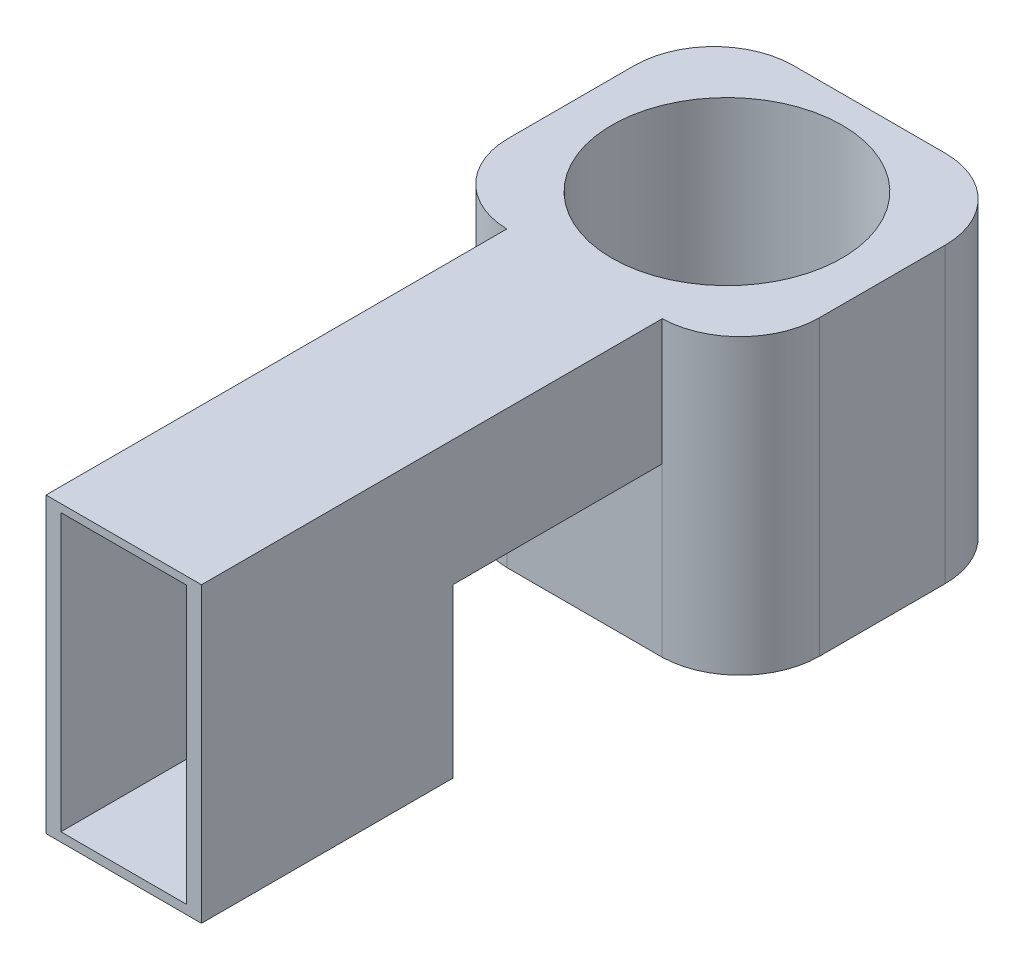
ISO-10303-21;
HEADER;
FILE_DESCRIPTION(('STEP AP214'),'2;1');
FILE_NAME('part.step','',(''),(''),'','','');
FILE_SCHEMA(('AUTOMOTIVE_DESIGN { 1 0 10303 214 1 1 1 1 }'));
ENDSEC;
DATA;
#1=APPLICATION_CONTEXT('core data for automotive mechanical design processes');
#2=APPLICATION_PROTOCOL_DEFINITION('international standard','automotive_design',2000,#1);
#3=PRODUCT_CONTEXT('',#1,'mechanical');
#4=PRODUCT('Part','Part','',(#3));
#5=PRODUCT_RELATED_PRODUCT_CATEGORY('part','',(#4));
#6=PRODUCT_DEFINITION_FORMATION('','',#4);
#7=PRODUCT_DEFINITION_CONTEXT('part definition',#1,'design');
#8=PRODUCT_DEFINITION('design','',#6,#7);
#9=PRODUCT_DEFINITION_SHAPE('','',#8);
#10=(LENGTH_UNIT() NAMED_UNIT(*) SI_UNIT(.MILLI.,.METRE.));
#11=(NAMED_UNIT(*) PLANE_ANGLE_UNIT() SI_UNIT($,.RADIAN.));
#12=(NAMED_UNIT(*) SI_UNIT($,.STERADIAN.) SOLID_ANGLE_UNIT());
#13=UNCERTAINTY_MEASURE_WITH_UNIT(LENGTH_MEASURE(1.E-05),#10,'distance_accuracy_value','');
#14=(GEOMETRIC_REPRESENTATION_CONTEXT(3) GLOBAL_UNCERTAINTY_ASSIGNED_CONTEXT((#13)) GLOBAL_UNIT_ASSIGNED_CONTEXT((#10,
#11,#12)) REPRESENTATION_CONTEXT('',''));
#15=CARTESIAN_POINT('',(0.,0.,0.));
#16=DIRECTION('',(0.,0.,1.));
#17=DIRECTION('',(1.,0.,0.));
#18=AXIS2_PLACEMENT_3D('',#15,#16,#17);
#19=CARTESIAN_POINT('',(0.,-70.,0.));
#20=DIRECTION('',(0.,1.,0.));
#21=DIRECTION('',(0.,0.,1.));
#22=AXIS2_PLACEMENT_3D('',#19,#20,#21);
#23=PLANE('',#22);
#24=CARTESIAN_POINT('',(-37.1118444749738,-70.,34.));
#25=DIRECTION('',(0.,1.,0.));
#26=DIRECTION('',(0.,0.,1.));
#27=AXIS2_PLACEMENT_3D('',#24,#25,#26);
#28=CIRCLE('',#27,27.5);
#29=CARTESIAN_POINT('',(-37.1118444749738,-70.,61.5));
#30=VERTEX_POINT('',#29);
#31=EDGE_CURVE('E254',#30,#30,#28,.T.);
#32=ORIENTED_EDGE('',*,*,#31,.T.);
#33=EDGE_LOOP('',(#32));
#34=FACE_BOUND('',#33,.T.);
#35=CARTESIAN_POINT('',(-19.,-70.,49.0051903157509));
#36=DIRECTION('',(0.,1.,0.));
#37=DIRECTION('',(0.,0.,1.));
#38=AXIS2_PLACEMENT_3D('',#35,#36,#37);
#39=CIRCLE('',#38,19.);
#40=CARTESIAN_POINT('',(0.,-70.,49.0051903157509));
#41=VERTEX_POINT('',#40);
#42=CARTESIAN_POINT('',(-18.5559222374874,-70.,68.));
#43=VERTEX_POINT('',#42);
#44=EDGE_CURVE('E325',#41,#43,#39,.F.);
#45=ORIENTED_EDGE('',*,*,#44,.T.);
#46=DIRECTION('',(-1.,0.,0.));
#47=VECTOR('',#46,1.);
#48=CARTESIAN_POINT('',(2.33223328753923,-70.,68.));
#49=LINE('',#48,#47);
#50=CARTESIAN_POINT('',(-55.6677667124608,-70.,68.));
#51=VERTEX_POINT('',#50);
#52=EDGE_CURVE('E239',#43,#51,#49,.T.);
#53=ORIENTED_EDGE('',*,*,#52,.T.);
#54=CARTESIAN_POINT('',(-55.2236889499477,-70.,49.005190315751));
#55=DIRECTION('',(0.,1.,0.));
#56=DIRECTION('',(0.,0.,1.));
#57=AXIS2_PLACEMENT_3D('',#54,#55,#56);
#58=CIRCLE('',#57,19.);
#59=CARTESIAN_POINT('',(-74.2236889499477,-70.,49.0051903157509));
#60=VERTEX_POINT('',#59);
#61=EDGE_CURVE('E321',#51,#60,#58,.F.);
#62=ORIENTED_EDGE('',*,*,#61,.T.);
#63=DIRECTION('',(0.,0.,1.));
#64=VECTOR('',#63,1.);
#65=CARTESIAN_POINT('',(-74.2236889499477,-70.,0.));
#66=LINE('',#65,#64);
#67=CARTESIAN_POINT('',(-74.2236889499477,-70.,19.));
#68=VERTEX_POINT('',#67);
#69=EDGE_CURVE('E263',#68,#60,#66,.T.);
#70=ORIENTED_EDGE('',*,*,#69,.F.);
#71=CARTESIAN_POINT('',(-55.2236889499477,-70.,19.));
#72=DIRECTION('',(0.,1.,0.));
#73=DIRECTION('',(0.,0.,1.));
#74=AXIS2_PLACEMENT_3D('',#71,#72,#73);
#75=CIRCLE('',#74,19.);
#76=CARTESIAN_POINT('',(-55.2236889499477,-70.,0.));
#77=VERTEX_POINT('',#76);
#78=EDGE_CURVE('E319',#68,#77,#75,.F.);
#79=ORIENTED_EDGE('',*,*,#78,.T.);
#80=DIRECTION('',(-1.,0.,0.));
#81=VECTOR('',#80,1.);
#82=CARTESIAN_POINT('',(0.,-70.,0.));
#83=LINE('',#82,#81);
#84=CARTESIAN_POINT('',(-19.,-70.,0.));
#85=VERTEX_POINT('',#84);
#86=EDGE_CURVE('E260',#85,#77,#83,.T.);
#87=ORIENTED_EDGE('',*,*,#86,.F.);
#88=CARTESIAN_POINT('',(-19.,-70.,19.));
#89=DIRECTION('',(0.,1.,0.));
#90=DIRECTION('',(0.,0.,1.));
#91=AXIS2_PLACEMENT_3D('',#88,#89,#90);
#92=CIRCLE('',#91,19.);
#93=CARTESIAN_POINT('',(0.,-70.,19.));
#94=VERTEX_POINT('',#93);
#95=EDGE_CURVE('E323',#85,#94,#92,.F.);
#96=ORIENTED_EDGE('',*,*,#95,.T.);
#97=DIRECTION('',(0.,0.,1.));
#98=VECTOR('',#97,1.);
#99=CARTESIAN_POINT('',(0.,-70.,0.));
#100=LINE('',#99,#98);
#101=EDGE_CURVE('E275',#94,#41,#100,.T.);
#102=ORIENTED_EDGE('',*,*,#101,.T.);
#103=EDGE_LOOP('',(#45,#53,#62,#70,#79,#87,#96,#102));
#104=FACE_BOUND('',#103,.T.);
#105=ADVANCED_FACE('F34',(#34,#104),#23,.F.);
#106=CARTESIAN_POINT('',(0.,-70.,0.));
#107=DIRECTION('',(0.,0.,-1.));
#108=DIRECTION('',(-1.,0.,0.));
#109=AXIS2_PLACEMENT_3D('',#106,#107,#108);
#110=PLANE('',#109);
#111=DIRECTION('',(-1.,0.,0.));
#112=VECTOR('',#111,1.);
#113=CARTESIAN_POINT('',(0.,0.,0.));
#114=LINE('',#113,#112);
#115=CARTESIAN_POINT('',(-19.,0.,0.));
#116=VERTEX_POINT('',#115);
#117=CARTESIAN_POINT('',(-55.2236889499477,0.,0.));
#118=VERTEX_POINT('',#117);
#119=EDGE_CURVE('E257',#116,#118,#114,.T.);
#120=ORIENTED_EDGE('',*,*,#119,.F.);
#121=DIRECTION('',(0.,1.,0.));
#122=VECTOR('',#121,1.);
#123=CARTESIAN_POINT('',(-19.,-70.,0.));
#124=LINE('',#123,#122);
#125=EDGE_CURVE('E331',#116,#85,#124,.F.);
#126=ORIENTED_EDGE('',*,*,#125,.T.);
#127=ORIENTED_EDGE('',*,*,#86,.T.);
#128=DIRECTION('',(0.,1.,0.));
#129=VECTOR('',#128,1.);
#130=CARTESIAN_POINT('',(-55.2236889499477,-70.,0.));
#131=LINE('',#130,#129);
#132=EDGE_CURVE('E328',#77,#118,#131,.T.);
#133=ORIENTED_EDGE('',*,*,#132,.T.);
#134=EDGE_LOOP('',(#120,#126,#127,#133));
#135=FACE_BOUND('',#134,.T.);
#136=ADVANCED_FACE('F346',(#135),#110,.T.);
#137=CARTESIAN_POINT('',(0.,-70.,0.));
#138=DIRECTION('',(-1.,0.,0.));
#139=DIRECTION('',(0.,0.,1.));
#140=AXIS2_PLACEMENT_3D('',#137,#138,#139);
#141=PLANE('',#140);
#142=DIRECTION('',(0.,0.,1.));
#143=VECTOR('',#142,1.);
#144=CARTESIAN_POINT('',(0.,0.,0.));
#145=LINE('',#144,#143);
#146=CARTESIAN_POINT('',(0.,0.,19.));
#147=VERTEX_POINT('',#146);
#148=CARTESIAN_POINT('',(0.,0.,49.0051903157509));
#149=VERTEX_POINT('',#148);
#150=EDGE_CURVE('E264',#147,#149,#145,.T.);
#151=ORIENTED_EDGE('',*,*,#150,.T.);
#152=DIRECTION('',(0.,-1.,0.));
#153=VECTOR('',#152,1.);
#154=CARTESIAN_POINT('',(0.,-70.,49.0051903157509));
#155=LINE('',#154,#153);
#156=EDGE_CURVE('E317',#149,#41,#155,.T.);
#157=ORIENTED_EDGE('',*,*,#156,.T.);
#158=ORIENTED_EDGE('',*,*,#101,.F.);
#159=DIRECTION('',(0.,1.,0.));
#160=VECTOR('',#159,1.);
#161=CARTESIAN_POINT('',(0.,0.,19.));
#162=LINE('',#161,#160);
#163=EDGE_CURVE('E314',#94,#147,#162,.T.);
#164=ORIENTED_EDGE('',*,*,#163,.T.);
#165=EDGE_LOOP('',(#151,#157,#158,#164));
#166=FACE_BOUND('',#165,.T.);
#167=ADVANCED_FACE('F357',(#166),#141,.F.);
#168=CARTESIAN_POINT('',(-18.5559222374869,-70.,0.));
#169=DIRECTION('',(1.,0.,0.));
#170=DIRECTION('',(0.,0.,-1.));
#171=AXIS2_PLACEMENT_3D('',#168,#169,#170);
#172=PLANE('',#171);
#173=DIRECTION('',(0.,0.,1.));
#174=VECTOR('',#173,1.);
#175=CARTESIAN_POINT('',(-18.5559222374869,-30.,0.));
#176=LINE('',#175,#174);
#177=CARTESIAN_POINT('',(-18.5559222374874,-30.,68.));
#178=VERTEX_POINT('',#177);
#179=CARTESIAN_POINT('',(-18.5559222374869,-30.,118.));
#180=VERTEX_POINT('',#179);
#181=EDGE_CURVE('E243',#178,#180,#176,.T.);
#182=ORIENTED_EDGE('',*,*,#181,.F.);
#183=DIRECTION('',(0.,1.,0.));
#184=VECTOR('',#183,1.);
#185=CARTESIAN_POINT('',(-18.5559222374869,-70.,68.));
#186=LINE('',#185,#184);
#187=CARTESIAN_POINT('',(-18.5559222374869,0.,68.));
#188=VERTEX_POINT('',#187);
#189=EDGE_CURVE('E298',#178,#188,#186,.T.);
#190=ORIENTED_EDGE('',*,*,#189,.T.);
#191=DIRECTION('',(0.,0.,-1.));
#192=VECTOR('',#191,1.);
#193=CARTESIAN_POINT('',(-18.5559222374869,0.,0.));
#194=LINE('',#193,#192);
#195=CARTESIAN_POINT('',(-18.5559222374869,0.,178.));
#196=VERTEX_POINT('',#195);
#197=EDGE_CURVE('E290',#196,#188,#194,.T.);
#198=ORIENTED_EDGE('',*,*,#197,.F.);
#199=DIRECTION('',(0.,1.,0.));
#200=VECTOR('',#199,1.);
#201=CARTESIAN_POINT('',(-18.5559222374869,-70.,178.));
#202=LINE('',#201,#200);
#203=CARTESIAN_POINT('',(-18.5559222374869,-70.,178.));
#204=VERTEX_POINT('',#203);
#205=EDGE_CURVE('E299',#204,#196,#202,.T.);
#206=ORIENTED_EDGE('',*,*,#205,.F.);
#207=DIRECTION('',(0.,0.,-1.));
#208=VECTOR('',#207,1.);
#209=CARTESIAN_POINT('',(-18.5559222374869,-70.,0.));
#210=LINE('',#209,#208);
#211=CARTESIAN_POINT('',(-18.5559222374869,-70.,118.));
#212=VERTEX_POINT('',#211);
#213=EDGE_CURVE('E272',#204,#212,#210,.T.);
#214=ORIENTED_EDGE('',*,*,#213,.T.);
#215=DIRECTION('',(0.,-1.,0.));
#216=VECTOR('',#215,1.);
#217=CARTESIAN_POINT('',(-18.5559222374869,-70.,118.));
#218=LINE('',#217,#216);
#219=EDGE_CURVE('E251',#180,#212,#218,.T.);
#220=ORIENTED_EDGE('',*,*,#219,.F.);
#221=EDGE_LOOP('',(#182,#190,#198,#206,#214,#220));
#222=FACE_BOUND('',#221,.T.);
#223=ADVANCED_FACE('F376',(#222),#172,.T.);
#224=CARTESIAN_POINT('',(0.,-70.,178.));
#225=DIRECTION('',(0.,0.,-1.));
#226=DIRECTION('',(-1.,0.,0.));
#227=AXIS2_PLACEMENT_3D('',#224,#225,#226);
#228=PLANE('',#227);
#229=DIRECTION('',(0.,1.,0.));
#230=VECTOR('',#229,1.);
#231=CARTESIAN_POINT('',(-52.1177667124607,-68.,178.));
#232=LINE('',#231,#230);
#233=CARTESIAN_POINT('',(-52.1177667124607,-67.855,178.));
#234=VERTEX_POINT('',#233);
#235=CARTESIAN_POINT('',(-52.1177667124607,-1.85612502307369,178.));
#236=VERTEX_POINT('',#235);
#237=EDGE_CURVE('E198',#234,#236,#232,.T.);
#238=ORIENTED_EDGE('',*,*,#237,.T.);
#239=DIRECTION('',(1.,0.,0.));
#240=VECTOR('',#239,1.);
#241=CARTESIAN_POINT('',(-52.1177667124607,-1.85612502307369,178.));
#242=LINE('',#241,#240);
#243=CARTESIAN_POINT('',(-22.1059222374869,-1.8561250230737,178.));
#244=VERTEX_POINT('',#243);
#245=EDGE_CURVE('E49',#236,#244,#242,.T.);
#246=ORIENTED_EDGE('',*,*,#245,.T.);
#247=DIRECTION('',(0.,-1.,0.));
#248=VECTOR('',#247,1.);
#249=CARTESIAN_POINT('',(-22.1059222374869,-68.,178.));
#250=LINE('',#249,#248);
#251=CARTESIAN_POINT('',(-22.1059222374869,-67.855,178.));
#252=VERTEX_POINT('',#251);
#253=EDGE_CURVE('E204',#244,#252,#250,.T.);
#254=ORIENTED_EDGE('',*,*,#253,.T.);
#255=DIRECTION('',(-1.,0.,0.));
#256=VECTOR('',#255,1.);
#257=CARTESIAN_POINT('',(-52.1177667124607,-67.855,178.));
#258=LINE('',#257,#256);
#259=EDGE_CURVE('E659',#252,#234,#258,.T.);
#260=ORIENTED_EDGE('',*,*,#259,.T.);
#261=EDGE_LOOP('',(#238,#246,#254,#260));
#262=FACE_BOUND('',#261,.T.);
#263=DIRECTION('',(-1.,0.,0.));
#264=VECTOR('',#263,1.);
#265=CARTESIAN_POINT('',(0.,0.,178.));
#266=LINE('',#265,#264);
#267=CARTESIAN_POINT('',(-55.6677667124608,0.,178.));
#268=VERTEX_POINT('',#267);
#269=EDGE_CURVE('E287',#196,#268,#266,.T.);
#270=ORIENTED_EDGE('',*,*,#269,.T.);
#271=DIRECTION('',(0.,1.,0.));
#272=VECTOR('',#271,1.);
#273=CARTESIAN_POINT('',(-55.6677667124608,-70.,178.));
#274=LINE('',#273,#272);
#275=CARTESIAN_POINT('',(-55.6677667124608,-70.,178.));
#276=VERTEX_POINT('',#275);
#277=EDGE_CURVE('E301',#276,#268,#274,.T.);
#278=ORIENTED_EDGE('',*,*,#277,.F.);
#279=DIRECTION('',(-1.,0.,0.));
#280=VECTOR('',#279,1.);
#281=CARTESIAN_POINT('',(0.,-70.,178.));
#282=LINE('',#281,#280);
#283=EDGE_CURVE('E269',#204,#276,#282,.T.);
#284=ORIENTED_EDGE('',*,*,#283,.F.);
#285=ORIENTED_EDGE('',*,*,#205,.T.);
#286=EDGE_LOOP('',(#270,#278,#284,#285));
#287=FACE_BOUND('',#286,.T.);
#288=ADVANCED_FACE('F395',(#262,#287),#228,.F.);
#289=CARTESIAN_POINT('',(-55.6677667124608,-70.,0.));
#290=DIRECTION('',(-1.,0.,0.));
#291=DIRECTION('',(0.,0.,1.));
#292=AXIS2_PLACEMENT_3D('',#289,#290,#291);
#293=PLANE('',#292);
#294=DIRECTION('',(0.,0.,-1.));
#295=VECTOR('',#294,1.);
#296=CARTESIAN_POINT('',(-55.6677667124608,-30.,68.));
#297=LINE('',#296,#295);
#298=CARTESIAN_POINT('',(-55.6677667124608,-30.,118.));
#299=VERTEX_POINT('',#298);
#300=CARTESIAN_POINT('',(-55.6677667124608,-30.,68.));
#301=VERTEX_POINT('',#300);
#302=EDGE_CURVE('E237',#299,#301,#297,.T.);
#303=ORIENTED_EDGE('',*,*,#302,.F.);
#304=DIRECTION('',(0.,1.,0.));
#305=VECTOR('',#304,1.);
#306=CARTESIAN_POINT('',(-55.6677667124608,-70.,118.));
#307=LINE('',#306,#305);
#308=CARTESIAN_POINT('',(-55.6677667124608,-70.,118.));
#309=VERTEX_POINT('',#308);
#310=EDGE_CURVE('E234',#309,#299,#307,.T.);
#311=ORIENTED_EDGE('',*,*,#310,.F.);
#312=DIRECTION('',(0.,0.,1.));
#313=VECTOR('',#312,1.);
#314=CARTESIAN_POINT('',(-55.6677667124608,-70.,0.));
#315=LINE('',#314,#313);
#316=EDGE_CURVE('E267',#309,#276,#315,.T.);
#317=ORIENTED_EDGE('',*,*,#316,.T.);
#318=ORIENTED_EDGE('',*,*,#277,.T.);
#319=DIRECTION('',(0.,0.,1.));
#320=VECTOR('',#319,1.);
#321=CARTESIAN_POINT('',(-55.6677667124608,0.,0.));
#322=LINE('',#321,#320);
#323=CARTESIAN_POINT('',(-55.6677667124608,0.,68.));
#324=VERTEX_POINT('',#323);
#325=EDGE_CURVE('E284',#324,#268,#322,.T.);
#326=ORIENTED_EDGE('',*,*,#325,.F.);
#327=DIRECTION('',(0.,1.,0.));
#328=VECTOR('',#327,1.);
#329=CARTESIAN_POINT('',(-55.6677667124608,-70.,68.));
#330=LINE('',#329,#328);
#331=EDGE_CURVE('E278',#301,#324,#330,.T.);
#332=ORIENTED_EDGE('',*,*,#331,.F.);
#333=EDGE_LOOP('',(#303,#311,#317,#318,#326,#332));
#334=FACE_BOUND('',#333,.T.);
#335=ADVANCED_FACE('F389',(#334),#293,.T.);
#336=CARTESIAN_POINT('',(-74.2236889499477,-70.,0.));
#337=DIRECTION('',(-1.,0.,0.));
#338=DIRECTION('',(0.,0.,1.));
#339=AXIS2_PLACEMENT_3D('',#336,#337,#338);
#340=PLANE('',#339);
#341=ORIENTED_EDGE('',*,*,#69,.T.);
#342=DIRECTION('',(0.,-1.,0.));
#343=VECTOR('',#342,1.);
#344=CARTESIAN_POINT('',(-74.2236889499477,0.,49.0051903157509));
#345=LINE('',#344,#343);
#346=CARTESIAN_POINT('',(-74.2236889499477,0.,49.0051903157509));
#347=VERTEX_POINT('',#346);
#348=EDGE_CURVE('E11',#60,#347,#345,.F.);
#349=ORIENTED_EDGE('',*,*,#348,.T.);
#350=DIRECTION('',(0.,0.,1.));
#351=VECTOR('',#350,1.);
#352=CARTESIAN_POINT('',(-74.2236889499477,0.,0.));
#353=LINE('',#352,#351);
#354=CARTESIAN_POINT('',(-74.2236889499477,0.,19.));
#355=VERTEX_POINT('',#354);
#356=EDGE_CURVE('E281',#355,#347,#353,.T.);
#357=ORIENTED_EDGE('',*,*,#356,.F.);
#358=DIRECTION('',(0.,1.,0.));
#359=VECTOR('',#358,1.);
#360=CARTESIAN_POINT('',(-74.2236889499477,-70.,19.));
#361=LINE('',#360,#359);
#362=EDGE_CURVE('E42',#355,#68,#361,.F.);
#363=ORIENTED_EDGE('',*,*,#362,.T.);
#364=EDGE_LOOP('',(#341,#349,#357,#363));
#365=FACE_BOUND('',#364,.T.);
#366=ADVANCED_FACE('F336',(#365),#340,.T.);
#367=ORIENTED_EDGE('',*,*,#316,.F.);
#368=DIRECTION('',(-1.,0.,0.));
#369=VECTOR('',#368,1.);
#370=CARTESIAN_POINT('',(2.33223328753923,-70.,118.));
#371=LINE('',#370,#369);
#372=EDGE_CURVE('E246',#212,#309,#371,.T.);
#373=ORIENTED_EDGE('',*,*,#372,.F.);
#374=ORIENTED_EDGE('',*,*,#213,.F.);
#375=ORIENTED_EDGE('',*,*,#283,.T.);
#376=EDGE_LOOP('',(#367,#373,#374,#375));
#377=FACE_BOUND('',#376,.T.);
#378=ADVANCED_FACE('F385',(#377),#23,.F.);
#379=CARTESIAN_POINT('',(0.,0.,0.));
#380=DIRECTION('',(0.,1.,0.));
#381=DIRECTION('',(0.,0.,1.));
#382=AXIS2_PLACEMENT_3D('',#379,#380,#381);
#383=PLANE('',#382);
#384=CARTESIAN_POINT('',(-37.1118444749738,0.,34.));
#385=DIRECTION('',(0.,1.,0.));
#386=DIRECTION('',(0.,0.,1.));
#387=AXIS2_PLACEMENT_3D('',#384,#385,#386);
#388=CIRCLE('',#387,27.5);
#389=CARTESIAN_POINT('',(-37.1118444749738,0.,61.5));
#390=VERTEX_POINT('',#389);
#391=EDGE_CURVE('E253',#390,#390,#388,.T.);
#392=ORIENTED_EDGE('',*,*,#391,.F.);
#393=EDGE_LOOP('',(#392));
#394=FACE_BOUND('',#393,.T.);
#395=ORIENTED_EDGE('',*,*,#197,.T.);
#396=CARTESIAN_POINT('',(-19.,0.,49.0051903157509));
#397=DIRECTION('',(0.,1.,0.));
#398=DIRECTION('',(0.,0.,1.));
#399=AXIS2_PLACEMENT_3D('',#396,#397,#398);
#400=CIRCLE('',#399,19.);
#401=EDGE_CURVE('E312',#188,#149,#400,.T.);
#402=ORIENTED_EDGE('',*,*,#401,.T.);
#403=ORIENTED_EDGE('',*,*,#150,.F.);
#404=CARTESIAN_POINT('',(-19.,0.,19.));
#405=DIRECTION('',(0.,1.,0.));
#406=DIRECTION('',(0.,0.,1.));
#407=AXIS2_PLACEMENT_3D('',#404,#405,#406);
#408=CIRCLE('',#407,19.);
#409=EDGE_CURVE('E310',#147,#116,#408,.T.);
#410=ORIENTED_EDGE('',*,*,#409,.T.);
#411=ORIENTED_EDGE('',*,*,#119,.T.);
#412=CARTESIAN_POINT('',(-55.2236889499477,0.,19.));
#413=DIRECTION('',(0.,1.,0.));
#414=DIRECTION('',(0.,0.,1.));
#415=AXIS2_PLACEMENT_3D('',#412,#413,#414);
#416=CIRCLE('',#415,19.);
#417=EDGE_CURVE('E297',#118,#355,#416,.T.);
#418=ORIENTED_EDGE('',*,*,#417,.T.);
#419=ORIENTED_EDGE('',*,*,#356,.T.);
#420=CARTESIAN_POINT('',(-55.2236889499477,0.,49.005190315751));
#421=DIRECTION('',(0.,1.,0.));
#422=DIRECTION('',(0.,0.,1.));
#423=AXIS2_PLACEMENT_3D('',#420,#421,#422);
#424=CIRCLE('',#423,19.);
#425=EDGE_CURVE('E307',#347,#324,#424,.T.);
#426=ORIENTED_EDGE('',*,*,#425,.T.);
#427=ORIENTED_EDGE('',*,*,#325,.T.);
#428=ORIENTED_EDGE('',*,*,#269,.F.);
#429=EDGE_LOOP('',(#395,#402,#403,#410,#411,#418,#419,#426,#427,#428));
#430=FACE_BOUND('',#429,.T.);
#431=ADVANCED_FACE('F349',(#394,#430),#383,.T.);
#432=CARTESIAN_POINT('',(-37.1118444749738,-70.,34.));
#433=DIRECTION('',(0.,1.,0.));
#434=DIRECTION('',(0.,0.,1.));
#435=AXIS2_PLACEMENT_3D('',#432,#433,#434);
#436=CYLINDRICAL_SURFACE('',#435,27.5);
#437=ORIENTED_EDGE('',*,*,#31,.F.);
#438=EDGE_LOOP('',(#437));
#439=FACE_BOUND('',#438,.T.);
#440=ORIENTED_EDGE('',*,*,#391,.T.);
#441=EDGE_LOOP('',(#440));
#442=FACE_BOUND('',#441,.T.);
#443=ADVANCED_FACE('F420',(#439,#442),#436,.F.);
#444=CARTESIAN_POINT('',(-19.,-70.,49.0051903157509));
#445=DIRECTION('',(0.,-1.,0.));
#446=DIRECTION('',(0.,0.,-1.));
#447=AXIS2_PLACEMENT_3D('',#444,#445,#446);
#448=CYLINDRICAL_SURFACE('',#447,19.);
#449=ORIENTED_EDGE('',*,*,#44,.F.);
#450=ORIENTED_EDGE('',*,*,#156,.F.);
#451=ORIENTED_EDGE('',*,*,#401,.F.);
#452=ORIENTED_EDGE('',*,*,#189,.F.);
#453=EDGE_CURVE('E295',#43,#178,#186,.T.);
#454=ORIENTED_EDGE('',*,*,#453,.F.);
#455=EDGE_LOOP('',(#449,#450,#451,#452,#454));
#456=FACE_BOUND('',#455,.T.);
#457=ADVANCED_FACE('F362',(#456),#448,.T.);
#458=CARTESIAN_POINT('',(-19.,-70.,19.));
#459=DIRECTION('',(0.,-1.,0.));
#460=DIRECTION('',(0.,0.,-1.));
#461=AXIS2_PLACEMENT_3D('',#458,#459,#460);
#462=CYLINDRICAL_SURFACE('',#461,19.);
#463=ORIENTED_EDGE('',*,*,#95,.F.);
#464=ORIENTED_EDGE('',*,*,#125,.F.);
#465=ORIENTED_EDGE('',*,*,#409,.F.);
#466=ORIENTED_EDGE('',*,*,#163,.F.);
#467=EDGE_LOOP('',(#463,#464,#465,#466));
#468=FACE_BOUND('',#467,.T.);
#469=ADVANCED_FACE('F354',(#468),#462,.T.);
#470=CARTESIAN_POINT('',(-55.2236889499477,-70.,49.005190315751));
#471=DIRECTION('',(0.,1.,0.));
#472=DIRECTION('',(0.,0.,1.));
#473=AXIS2_PLACEMENT_3D('',#470,#471,#472);
#474=CYLINDRICAL_SURFACE('',#473,19.);
#475=ORIENTED_EDGE('',*,*,#61,.F.);
#476=EDGE_CURVE('E303',#51,#301,#330,.T.);
#477=ORIENTED_EDGE('',*,*,#476,.T.);
#478=ORIENTED_EDGE('',*,*,#331,.T.);
#479=ORIENTED_EDGE('',*,*,#425,.F.);
#480=ORIENTED_EDGE('',*,*,#348,.F.);
#481=EDGE_LOOP('',(#475,#477,#478,#479,#480));
#482=FACE_BOUND('',#481,.T.);
#483=ADVANCED_FACE('F392',(#482),#474,.T.);
#484=CARTESIAN_POINT('',(-55.2236889499477,-70.,19.));
#485=DIRECTION('',(0.,1.,0.));
#486=DIRECTION('',(0.,0.,1.));
#487=AXIS2_PLACEMENT_3D('',#484,#485,#486);
#488=CYLINDRICAL_SURFACE('',#487,19.);
#489=ORIENTED_EDGE('',*,*,#78,.F.);
#490=ORIENTED_EDGE('',*,*,#362,.F.);
#491=ORIENTED_EDGE('',*,*,#417,.F.);
#492=ORIENTED_EDGE('',*,*,#132,.F.);
#493=EDGE_LOOP('',(#489,#490,#491,#492));
#494=FACE_BOUND('',#493,.T.);
#495=ADVANCED_FACE('F36',(#494),#488,.T.);
#496=CARTESIAN_POINT('',(0.,0.,120.));
#497=DIRECTION('',(0.,0.,-1.));
#498=DIRECTION('',(-1.,0.,0.));
#499=AXIS2_PLACEMENT_3D('',#496,#497,#498);
#500=PLANE('',#499);
#501=DIRECTION('',(1.,0.,0.));
#502=VECTOR('',#501,1.);
#503=CARTESIAN_POINT('',(0.,-41.3697033529252,120.));
#504=LINE('',#503,#502);
#505=CARTESIAN_POINT('',(-52.072273208978,-41.3697033529252,120.));
#506=VERTEX_POINT('',#505);
#507=CARTESIAN_POINT('',(-22.5559222374869,-41.3697033529252,120.));
#508=VERTEX_POINT('',#507);
#509=EDGE_CURVE('E228',#506,#508,#504,.T.);
#510=ORIENTED_EDGE('',*,*,#509,.T.);
#511=DIRECTION('',(0.,-1.,0.));
#512=VECTOR('',#511,1.);
#513=CARTESIAN_POINT('',(-22.5559222374869,0.,120.));
#514=LINE('',#513,#512);
#515=CARTESIAN_POINT('',(-22.5559222374869,-60.,120.));
#516=VERTEX_POINT('',#515);
#517=EDGE_CURVE('E231',#508,#516,#514,.T.);
#518=ORIENTED_EDGE('',*,*,#517,.T.);
#519=DIRECTION('',(-1.,0.,0.));
#520=VECTOR('',#519,1.);
#521=CARTESIAN_POINT('',(0.,-60.,120.));
#522=LINE('',#521,#520);
#523=CARTESIAN_POINT('',(-52.072273208978,-60.,120.));
#524=VERTEX_POINT('',#523);
#525=EDGE_CURVE('E217',#516,#524,#522,.T.);
#526=ORIENTED_EDGE('',*,*,#525,.T.);
#527=DIRECTION('',(0.,1.,0.));
#528=VECTOR('',#527,1.);
#529=CARTESIAN_POINT('',(-52.072273208978,0.,120.));
#530=LINE('',#529,#528);
#531=EDGE_CURVE('E225',#524,#506,#530,.T.);
#532=ORIENTED_EDGE('',*,*,#531,.T.);
#533=EDGE_LOOP('',(#510,#518,#526,#532));
#534=FACE_BOUND('',#533,.T.);
#535=DIRECTION('',(0.,-1.,0.));
#536=VECTOR('',#535,1.);
#537=CARTESIAN_POINT('',(-22.1059222374869,-68.,120.));
#538=LINE('',#537,#536);
#539=CARTESIAN_POINT('',(-22.1059222374869,-1.85612502307369,120.));
#540=VERTEX_POINT('',#539);
#541=CARTESIAN_POINT('',(-22.1059222374869,-67.855,120.));
#542=VERTEX_POINT('',#541);
#543=EDGE_CURVE('E192',#540,#542,#538,.T.);
#544=ORIENTED_EDGE('',*,*,#543,.F.);
#545=DIRECTION('',(1.,0.,0.));
#546=VECTOR('',#545,1.);
#547=CARTESIAN_POINT('',(-52.1177667124607,-1.85612502307369,120.));
#548=LINE('',#547,#546);
#549=CARTESIAN_POINT('',(-52.1177667124607,-1.85612502307369,120.));
#550=VERTEX_POINT('',#549);
#551=EDGE_CURVE('E179',#550,#540,#548,.T.);
#552=ORIENTED_EDGE('',*,*,#551,.F.);
#553=DIRECTION('',(0.,1.,0.));
#554=VECTOR('',#553,1.);
#555=CARTESIAN_POINT('',(-52.1177667124607,-68.,120.));
#556=LINE('',#555,#554);
#557=CARTESIAN_POINT('',(-52.1177667124607,-67.855,120.));
#558=VERTEX_POINT('',#557);
#559=EDGE_CURVE('E191',#558,#550,#556,.T.);
#560=ORIENTED_EDGE('',*,*,#559,.F.);
#561=DIRECTION('',(-1.,0.,0.));
#562=VECTOR('',#561,1.);
#563=CARTESIAN_POINT('',(-52.1177667124607,-67.855,120.));
#564=LINE('',#563,#562);
#565=EDGE_CURVE('E662',#542,#558,#564,.T.);
#566=ORIENTED_EDGE('',*,*,#565,.F.);
#567=EDGE_LOOP('',(#544,#552,#560,#566));
#568=FACE_BOUND('',#567,.T.);
#569=ADVANCED_FACE('F189',(#534,#568),#500,.F.);
#570=CARTESIAN_POINT('',(2.33223328753923,-70.,68.));
#571=DIRECTION('',(0.,0.,-1.));
#572=DIRECTION('',(-1.,0.,0.));
#573=AXIS2_PLACEMENT_3D('',#570,#571,#572);
#574=PLANE('',#573);
#575=ORIENTED_EDGE('',*,*,#453,.T.);
#576=DIRECTION('',(-1.,0.,0.));
#577=VECTOR('',#576,1.);
#578=CARTESIAN_POINT('',(2.33223328753923,-30.,68.));
#579=LINE('',#578,#577);
#580=EDGE_CURVE('E240',#178,#301,#579,.T.);
#581=ORIENTED_EDGE('',*,*,#580,.T.);
#582=ORIENTED_EDGE('',*,*,#476,.F.);
#583=ORIENTED_EDGE('',*,*,#52,.F.);
#584=EDGE_LOOP('',(#575,#581,#582,#583));
#585=FACE_BOUND('',#584,.T.);
#586=ADVANCED_FACE('F367',(#585),#574,.F.);
#587=CARTESIAN_POINT('',(2.33223328753923,-30.,68.));
#588=DIRECTION('',(0.,1.,0.));
#589=DIRECTION('',(0.,0.,1.));
#590=AXIS2_PLACEMENT_3D('',#587,#588,#589);
#591=PLANE('',#590);
#592=ORIENTED_EDGE('',*,*,#181,.T.);
#593=DIRECTION('',(-1.,0.,0.));
#594=VECTOR('',#593,1.);
#595=CARTESIAN_POINT('',(2.33223328753923,-30.,118.));
#596=LINE('',#595,#594);
#597=EDGE_CURVE('E244',#180,#299,#596,.T.);
#598=ORIENTED_EDGE('',*,*,#597,.T.);
#599=ORIENTED_EDGE('',*,*,#302,.T.);
#600=ORIENTED_EDGE('',*,*,#580,.F.);
#601=EDGE_LOOP('',(#592,#598,#599,#600));
#602=FACE_BOUND('',#601,.T.);
#603=ADVANCED_FACE('F371',(#602),#591,.F.);
#604=CARTESIAN_POINT('',(2.33223328753923,-70.,118.));
#605=DIRECTION('',(0.,0.,1.));
#606=DIRECTION('',(1.,0.,0.));
#607=AXIS2_PLACEMENT_3D('',#604,#605,#606);
#608=PLANE('',#607);
#609=DIRECTION('',(-1.,0.,0.));
#610=VECTOR('',#609,1.);
#611=CARTESIAN_POINT('',(-22.5559222374869,-60.,118.));
#612=LINE('',#611,#610);
#613=CARTESIAN_POINT('',(-22.5559222374869,-60.,118.));
#614=VERTEX_POINT('',#613);
#615=CARTESIAN_POINT('',(-52.072273208978,-60.,118.));
#616=VERTEX_POINT('',#615);
#617=EDGE_CURVE('E200',#614,#616,#612,.T.);
#618=ORIENTED_EDGE('',*,*,#617,.F.);
#619=DIRECTION('',(0.,-1.,0.));
#620=VECTOR('',#619,1.);
#621=CARTESIAN_POINT('',(-22.5559222374869,-41.3697033529252,118.));
#622=LINE('',#621,#620);
#623=CARTESIAN_POINT('',(-22.5559222374869,-41.3697033529252,118.));
#624=VERTEX_POINT('',#623);
#625=EDGE_CURVE('E197',#624,#614,#622,.T.);
#626=ORIENTED_EDGE('',*,*,#625,.F.);
#627=DIRECTION('',(1.,0.,0.));
#628=VECTOR('',#627,1.);
#629=CARTESIAN_POINT('',(-22.5559222374869,-41.3697033529252,118.));
#630=LINE('',#629,#628);
#631=CARTESIAN_POINT('',(-52.072273208978,-41.3697033529252,118.));
#632=VERTEX_POINT('',#631);
#633=EDGE_CURVE('E211',#632,#624,#630,.T.);
#634=ORIENTED_EDGE('',*,*,#633,.F.);
#635=DIRECTION('',(0.,1.,0.));
#636=VECTOR('',#635,1.);
#637=CARTESIAN_POINT('',(-52.072273208978,-41.3697033529252,118.));
#638=LINE('',#637,#636);
#639=EDGE_CURVE('E208',#616,#632,#638,.T.);
#640=ORIENTED_EDGE('',*,*,#639,.F.);
#641=EDGE_LOOP('',(#618,#626,#634,#640));
#642=FACE_BOUND('',#641,.T.);
#643=ORIENTED_EDGE('',*,*,#219,.T.);
#644=ORIENTED_EDGE('',*,*,#372,.T.);
#645=ORIENTED_EDGE('',*,*,#310,.T.);
#646=ORIENTED_EDGE('',*,*,#597,.F.);
#647=EDGE_LOOP('',(#643,#644,#645,#646));
#648=FACE_BOUND('',#647,.T.);
#649=ADVANCED_FACE('F381',(#642,#648),#608,.F.);
#650=CARTESIAN_POINT('',(-22.5559222374869,-41.3697033529252,176.));
#651=DIRECTION('',(1.,0.,0.));
#652=DIRECTION('',(0.,1.,0.));
#653=AXIS2_PLACEMENT_3D('',#650,#651,#652);
#654=PLANE('',#653);
#655=DIRECTION('',(0.,0.,-1.));
#656=VECTOR('',#655,1.);
#657=CARTESIAN_POINT('',(-22.5559222374869,-41.3697033529252,176.));
#658=LINE('',#657,#656);
#659=EDGE_CURVE('E215',#508,#624,#658,.T.);
#660=ORIENTED_EDGE('',*,*,#659,.T.);
#661=ORIENTED_EDGE('',*,*,#625,.T.);
#662=DIRECTION('',(0.,0.,-1.));
#663=VECTOR('',#662,1.);
#664=CARTESIAN_POINT('',(-22.5559222374869,-60.,176.));
#665=LINE('',#664,#663);
#666=EDGE_CURVE('E214',#516,#614,#665,.T.);
#667=ORIENTED_EDGE('',*,*,#666,.F.);
#668=ORIENTED_EDGE('',*,*,#517,.F.);
#669=EDGE_LOOP('',(#660,#661,#667,#668));
#670=FACE_BOUND('',#669,.T.);
#671=ADVANCED_FACE('F580',(#670),#654,.F.);
#672=CARTESIAN_POINT('',(-22.5559222374869,-41.3697033529252,176.));
#673=DIRECTION('',(0.,1.,0.));
#674=DIRECTION('',(0.,0.,1.));
#675=AXIS2_PLACEMENT_3D('',#672,#673,#674);
#676=PLANE('',#675);
#677=DIRECTION('',(0.,0.,-1.));
#678=VECTOR('',#677,1.);
#679=CARTESIAN_POINT('',(-52.072273208978,-41.3697033529252,176.));
#680=LINE('',#679,#678);
#681=EDGE_CURVE('E218',#506,#632,#680,.T.);
#682=ORIENTED_EDGE('',*,*,#681,.T.);
#683=ORIENTED_EDGE('',*,*,#633,.T.);
#684=ORIENTED_EDGE('',*,*,#659,.F.);
#685=ORIENTED_EDGE('',*,*,#509,.F.);
#686=EDGE_LOOP('',(#682,#683,#684,#685));
#687=FACE_BOUND('',#686,.T.);
#688=ADVANCED_FACE('F571',(#687),#676,.F.);
#689=CARTESIAN_POINT('',(-52.072273208978,-41.3697033529252,176.));
#690=DIRECTION('',(-1.,0.,0.));
#691=DIRECTION('',(0.,0.,1.));
#692=AXIS2_PLACEMENT_3D('',#689,#690,#691);
#693=PLANE('',#692);
#694=DIRECTION('',(0.,0.,-1.));
#695=VECTOR('',#694,1.);
#696=CARTESIAN_POINT('',(-52.072273208978,-60.,176.));
#697=LINE('',#696,#695);
#698=EDGE_CURVE('E57',#524,#616,#697,.T.);
#699=ORIENTED_EDGE('',*,*,#698,.T.);
#700=ORIENTED_EDGE('',*,*,#639,.T.);
#701=ORIENTED_EDGE('',*,*,#681,.F.);
#702=ORIENTED_EDGE('',*,*,#531,.F.);
#703=EDGE_LOOP('',(#699,#700,#701,#702));
#704=FACE_BOUND('',#703,.T.);
#705=ADVANCED_FACE('F563',(#704),#693,.F.);
#706=CARTESIAN_POINT('',(-22.5559222374869,-60.,176.));
#707=DIRECTION('',(0.,-1.,0.));
#708=DIRECTION('',(0.,0.,-1.));
#709=AXIS2_PLACEMENT_3D('',#706,#707,#708);
#710=PLANE('',#709);
#711=ORIENTED_EDGE('',*,*,#666,.T.);
#712=ORIENTED_EDGE('',*,*,#617,.T.);
#713=ORIENTED_EDGE('',*,*,#698,.F.);
#714=ORIENTED_EDGE('',*,*,#525,.F.);
#715=EDGE_LOOP('',(#711,#712,#713,#714));
#716=FACE_BOUND('',#715,.T.);
#717=ADVANCED_FACE('F558',(#716),#710,.F.);
#718=CARTESIAN_POINT('',(-52.1177667124607,-68.,120.));
#719=DIRECTION('',(1.,0.,0.));
#720=DIRECTION('',(0.,0.,-1.));
#721=AXIS2_PLACEMENT_3D('',#718,#719,#720);
#722=PLANE('',#721);
#723=DIRECTION('',(0.,0.,1.));
#724=VECTOR('',#723,1.);
#725=CARTESIAN_POINT('',(-52.1177667124607,-1.85612502307369,120.));
#726=LINE('',#725,#724);
#727=EDGE_CURVE('E176',#550,#236,#726,.T.);
#728=ORIENTED_EDGE('',*,*,#727,.T.);
#729=ORIENTED_EDGE('',*,*,#237,.F.);
#730=DIRECTION('',(0.,0.,1.));
#731=VECTOR('',#730,1.);
#732=CARTESIAN_POINT('',(-52.1177667124607,-67.855,120.));
#733=LINE('',#732,#731);
#734=EDGE_CURVE('E196',#558,#234,#733,.T.);
#735=ORIENTED_EDGE('',*,*,#734,.F.);
#736=ORIENTED_EDGE('',*,*,#559,.T.);
#737=EDGE_LOOP('',(#728,#729,#735,#736));
#738=FACE_BOUND('',#737,.T.);
#739=ADVANCED_FACE('F195',(#738),#722,.T.);
#740=CARTESIAN_POINT('',(-22.1059222374869,-68.,120.));
#741=DIRECTION('',(-1.,0.,0.));
#742=DIRECTION('',(0.,0.,1.));
#743=AXIS2_PLACEMENT_3D('',#740,#741,#742);
#744=PLANE('',#743);
#745=DIRECTION('',(0.,0.,1.));
#746=VECTOR('',#745,1.);
#747=CARTESIAN_POINT('',(-22.1059222374869,-1.85612502307369,120.));
#748=LINE('',#747,#746);
#749=EDGE_CURVE('E184',#540,#244,#748,.T.);
#750=ORIENTED_EDGE('',*,*,#749,.F.);
#751=ORIENTED_EDGE('',*,*,#543,.T.);
#752=DIRECTION('',(0.,0.,1.));
#753=VECTOR('',#752,1.);
#754=CARTESIAN_POINT('',(-22.1059222374869,-67.855,120.));
#755=LINE('',#754,#753);
#756=EDGE_CURVE('E661',#542,#252,#755,.T.);
#757=ORIENTED_EDGE('',*,*,#756,.T.);
#758=ORIENTED_EDGE('',*,*,#253,.F.);
#759=EDGE_LOOP('',(#750,#751,#757,#758));
#760=FACE_BOUND('',#759,.T.);
#761=ADVANCED_FACE('F621',(#760),#744,.T.);
#762=CARTESIAN_POINT('',(-52.1177667124607,-67.855,120.));
#763=DIRECTION('',(0.,1.,0.));
#764=DIRECTION('',(0.,0.,1.));
#765=AXIS2_PLACEMENT_3D('',#762,#763,#764);
#766=PLANE('',#765);
#767=ORIENTED_EDGE('',*,*,#259,.F.);
#768=ORIENTED_EDGE('',*,*,#756,.F.);
#769=ORIENTED_EDGE('',*,*,#565,.T.);
#770=ORIENTED_EDGE('',*,*,#734,.T.);
#771=EDGE_LOOP('',(#767,#768,#769,#770));
#772=FACE_BOUND('',#771,.T.);
#773=ADVANCED_FACE('F624',(#772),#766,.T.);
#774=CARTESIAN_POINT('',(-52.1177667124607,-1.85612502307369,120.));
#775=DIRECTION('',(0.,-1.,0.));
#776=DIRECTION('',(0.,0.,-1.));
#777=AXIS2_PLACEMENT_3D('',#774,#775,#776);
#778=PLANE('',#777);
#779=ORIENTED_EDGE('',*,*,#245,.F.);
#780=ORIENTED_EDGE('',*,*,#727,.F.);
#781=ORIENTED_EDGE('',*,*,#551,.T.);
#782=ORIENTED_EDGE('',*,*,#749,.T.);
#783=EDGE_LOOP('',(#779,#780,#781,#782));
#784=FACE_BOUND('',#783,.T.);
#785=ADVANCED_FACE('F178',(#784),#778,.T.);
#786=CLOSED_SHELL('',(#105,#136,#167,#223,#288,#335,#366,#378,#431,#443,#457,#469,#483,#495,
#569,#586,#603,#649,#671,#688,#705,#717,#739,#761,#773,#785));
#787=MANIFOLD_SOLID_BREP('B2',#786);
#788=ADVANCED_BREP_SHAPE_REPRESENTATION('',(#18,#787),#14);
#789=SHAPE_DEFINITION_REPRESENTATION(#9,#788);
ENDSEC;
END-ISO-10303-21;
